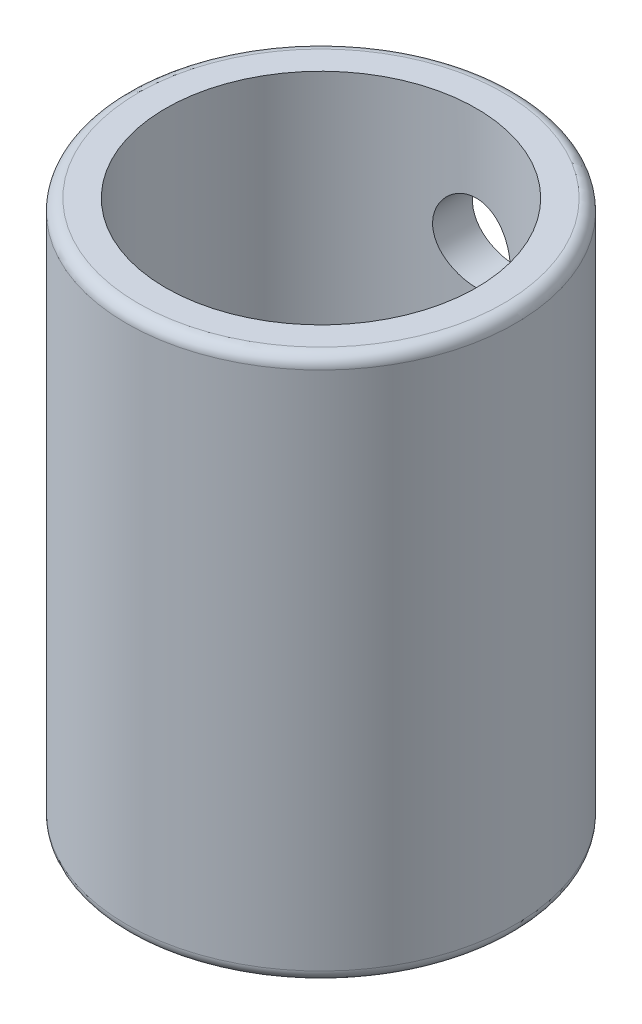
ISO-10303-21;
HEADER;
FILE_DESCRIPTION(('STEP AP214'),'2;1');
FILE_NAME('part.step','',(''),(''),'','','');
FILE_SCHEMA(('AUTOMOTIVE_DESIGN { 1 0 10303 214 1 1 1 1 }'));
ENDSEC;
DATA;
#1=APPLICATION_CONTEXT('core data for automotive mechanical design processes');
#2=APPLICATION_PROTOCOL_DEFINITION('international standard','automotive_design',2000,#1);
#3=PRODUCT_CONTEXT('',#1,'mechanical');
#4=PRODUCT('Part','Part','',(#3));
#5=PRODUCT_RELATED_PRODUCT_CATEGORY('part','',(#4));
#6=PRODUCT_DEFINITION_FORMATION('','',#4);
#7=PRODUCT_DEFINITION_CONTEXT('part definition',#1,'design');
#8=PRODUCT_DEFINITION('design','',#6,#7);
#9=PRODUCT_DEFINITION_SHAPE('','',#8);
#10=(LENGTH_UNIT() NAMED_UNIT(*) SI_UNIT(.MILLI.,.METRE.));
#11=(NAMED_UNIT(*) PLANE_ANGLE_UNIT() SI_UNIT($,.RADIAN.));
#12=(NAMED_UNIT(*) SI_UNIT($,.STERADIAN.) SOLID_ANGLE_UNIT());
#13=UNCERTAINTY_MEASURE_WITH_UNIT(LENGTH_MEASURE(1.E-05),#10,'distance_accuracy_value','');
#14=(GEOMETRIC_REPRESENTATION_CONTEXT(3) GLOBAL_UNCERTAINTY_ASSIGNED_CONTEXT((#13)) GLOBAL_UNIT_ASSIGNED_CONTEXT((#10,
#11,#12)) REPRESENTATION_CONTEXT('',''));
#15=CARTESIAN_POINT('',(0.,0.,0.));
#16=DIRECTION('',(0.,0.,1.));
#17=DIRECTION('',(1.,0.,0.));
#18=AXIS2_PLACEMENT_3D('',#15,#16,#17);
#19=CARTESIAN_POINT('',(0.,7.,0.));
#20=DIRECTION('',(0.,1.,0.));
#21=DIRECTION('',(0.,0.,1.));
#22=AXIS2_PLACEMENT_3D('',#19,#20,#21);
#23=PLANE('',#22);
#24=CARTESIAN_POINT('',(0.,7.,0.));
#25=DIRECTION('',(0.,1.,0.));
#26=DIRECTION('',(0.,0.,1.));
#27=AXIS2_PLACEMENT_3D('',#24,#25,#26);
#28=CIRCLE('',#27,2.5);
#29=CARTESIAN_POINT('',(0.,7.,2.5));
#30=VERTEX_POINT('',#29);
#31=EDGE_CURVE('E142',#30,#30,#28,.T.);
#32=ORIENTED_EDGE('',*,*,#31,.F.);
#33=EDGE_LOOP('',(#32));
#34=FACE_BOUND('',#33,.T.);
#35=CARTESIAN_POINT('',(0.,7.,0.));
#36=DIRECTION('',(0.,1.,0.));
#37=DIRECTION('',(0.,0.,1.));
#38=AXIS2_PLACEMENT_3D('',#35,#36,#37);
#39=CIRCLE('',#38,4.);
#40=CARTESIAN_POINT('',(0.,7.,4.));
#41=VERTEX_POINT('',#40);
#42=EDGE_CURVE('E148',#41,#41,#39,.F.);
#43=ORIENTED_EDGE('',*,*,#42,.F.);
#44=EDGE_LOOP('',(#43));
#45=FACE_BOUND('',#44,.T.);
#46=ADVANCED_FACE('F40',(#34,#45),#23,.T.);
#47=CARTESIAN_POINT('',(0.,0.,0.));
#48=DIRECTION('',(0.,1.,0.));
#49=DIRECTION('',(0.,0.,1.));
#50=AXIS2_PLACEMENT_3D('',#47,#48,#49);
#51=PLANE('',#50);
#52=CARTESIAN_POINT('',(0.,0.,0.));
#53=DIRECTION('',(0.,1.,0.));
#54=DIRECTION('',(0.,0.,1.));
#55=AXIS2_PLACEMENT_3D('',#52,#53,#54);
#56=CIRCLE('',#55,4.7);
#57=CARTESIAN_POINT('',(0.,0.,4.7));
#58=VERTEX_POINT('',#57);
#59=EDGE_CURVE('E54',#58,#58,#56,.F.);
#60=ORIENTED_EDGE('',*,*,#59,.T.);
#61=EDGE_LOOP('',(#60));
#62=FACE_BOUND('',#61,.T.);
#63=CARTESIAN_POINT('',(0.,0.,0.));
#64=DIRECTION('',(0.,1.,0.));
#65=DIRECTION('',(0.,0.,1.));
#66=AXIS2_PLACEMENT_3D('',#63,#64,#65);
#67=CIRCLE('',#66,2.5);
#68=CARTESIAN_POINT('',(0.,0.,2.5));
#69=VERTEX_POINT('',#68);
#70=EDGE_CURVE('E138',#69,#69,#67,.T.);
#71=ORIENTED_EDGE('',*,*,#70,.T.);
#72=EDGE_LOOP('',(#71));
#73=FACE_BOUND('',#72,.T.);
#74=ADVANCED_FACE('F100',(#62,#73),#51,.F.);
#75=CARTESIAN_POINT('',(0.,7.,0.));
#76=DIRECTION('',(0.,-1.,0.));
#77=DIRECTION('',(0.,0.,-1.));
#78=AXIS2_PLACEMENT_3D('',#75,#76,#77);
#79=CYLINDRICAL_SURFACE('',#78,5.);
#80=CARTESIAN_POINT('',(0.,12.,-5.));
#81=CARTESIAN_POINT('',(-0.0555769067926332,11.9999979555017,-4.99999897580871));
#82=CARTESIAN_POINT('',(-0.111179660201522,11.9953511570324,-4.99906385178231));
#83=CARTESIAN_POINT('',(-0.220813507689019,11.9769014998848,-4.99542365623231));
#84=CARTESIAN_POINT('',(-0.274843317541356,11.9630913671985,-4.99271717860186));
#85=CARTESIAN_POINT('',(-0.379730305263313,11.9267587263792,-4.98583649278287));
#86=CARTESIAN_POINT('',(-0.430590467933135,11.9042445631553,-4.98166369076718));
#87=CARTESIAN_POINT('',(-0.527807988864226,11.8511677524887,-4.97230398035314));
#88=CARTESIAN_POINT('',(-0.574165615075813,11.8206055843928,-4.96711713235707));
#89=CARTESIAN_POINT('',(-0.661693477314865,11.7518615057086,-4.9562216532997));
#90=CARTESIAN_POINT('',(-0.702793951158524,11.7135916446088,-4.95050745504347));
#91=CARTESIAN_POINT('',(-0.778036756608028,11.6307075836083,-4.93924180452588));
#92=CARTESIAN_POINT('',(-0.812178544770425,11.5860928886649,-4.93369036500424));
#93=CARTESIAN_POINT('',(-0.872831753347621,11.4912838069881,-4.92332441812615));
#94=CARTESIAN_POINT('',(-0.899270938865867,11.4410423562036,-4.91851707364946));
#95=CARTESIAN_POINT('',(-0.943305666580308,11.3367181809959,-4.91026268058418));
#96=CARTESIAN_POINT('',(-0.960902082437238,11.2826358366537,-4.90681549761962));
#97=CARTESIAN_POINT('',(-0.986525299884828,11.1729156360921,-4.90172805252204));
#98=CARTESIAN_POINT('',(-0.994674497958778,11.1173074558578,-4.90006470107188));
#99=CARTESIAN_POINT('',(-1.00155212772612,11.0054901786357,-4.89866375060627));
#100=CARTESIAN_POINT('',(-1.0002815227135,10.9492811436799,-4.89892595467841));
#101=CARTESIAN_POINT('',(-0.988454573101819,10.838753211979,-4.90132551148185));
#102=CARTESIAN_POINT('',(-0.978038540243906,10.7844185943727,-4.90343452858763));
#103=CARTESIAN_POINT('',(-0.948437884623051,10.678283923337,-4.90924546160001));
#104=CARTESIAN_POINT('',(-0.929252843100681,10.626483991081,-4.91294745357779));
#105=CARTESIAN_POINT('',(-0.88252478367472,10.5264847382964,-4.92155618500408));
#106=CARTESIAN_POINT('',(-0.854926151232114,10.4783121204308,-4.92647089813704));
#107=CARTESIAN_POINT('',(-0.792193574572679,10.3872291500272,-4.93694618773062));
#108=CARTESIAN_POINT('',(-0.757058764356829,10.3443194031488,-4.94250683838366));
#109=CARTESIAN_POINT('',(-0.679499934560584,10.2641705975431,-4.95377021241462));
#110=CARTESIAN_POINT('',(-0.636956161212444,10.2270474321409,-4.95947369210905));
#111=CARTESIAN_POINT('',(-0.546185024062009,10.1604461536988,-4.97028848714408));
#112=CARTESIAN_POINT('',(-0.497957587379389,10.1309681387064,-4.97539979488974));
#113=CARTESIAN_POINT('',(-0.39705938687892,10.080472490774,-4.98446690160887));
#114=CARTESIAN_POINT('',(-0.344381819585299,10.0594681063555,-4.98842088848272));
#115=CARTESIAN_POINT('',(-0.236148976448664,10.0266395259614,-4.99471408987858));
#116=CARTESIAN_POINT('',(-0.180594050072449,10.0148142179264,-4.99705350000531));
#117=CARTESIAN_POINT('',(-0.0691794056271505,10.0008435462057,-4.99982671866868));
#118=CARTESIAN_POINT('',(-0.0133403283255761,9.99853958045973,-5.0002917465247));
#119=CARTESIAN_POINT('',(0.0979249341927143,10.0032498589422,-4.99935051930103));
#120=CARTESIAN_POINT('',(0.153351142443793,10.0102635793526,-4.99794436941446));
#121=CARTESIAN_POINT('',(0.261705659946541,10.033278373544,-4.99343832008018));
#122=CARTESIAN_POINT('',(0.314651948339904,10.0491980684979,-4.99035376404206));
#123=CARTESIAN_POINT('',(0.417123627499668,10.0894839826558,-4.98283552061033));
#124=CARTESIAN_POINT('',(0.46664876163754,10.1138508346768,-4.97840173214227));
#125=CARTESIAN_POINT('',(0.561541173686218,10.1706824906513,-4.96859911533294));
#126=CARTESIAN_POINT('',(0.606850126752189,10.2032427810389,-4.96321950437052));
#127=CARTESIAN_POINT('',(0.691418019119207,10.2754091912073,-4.95214734829882));
#128=CARTESIAN_POINT('',(0.730676308930763,10.3150160663999,-4.94645476968388));
#129=CARTESIAN_POINT('',(0.802640590774177,10.4008733518911,-4.93529303556965));
#130=CARTESIAN_POINT('',(0.835237702448656,10.4472157442213,-4.92982860233304));
#131=CARTESIAN_POINT('',(0.892185420051206,10.5448113613567,-4.91984191796194));
#132=CARTESIAN_POINT('',(0.916536355922903,10.5960643895736,-4.91531962913342));
#133=CARTESIAN_POINT('',(0.95615184158196,10.7017682461495,-4.90776740584383));
#134=CARTESIAN_POINT('',(0.971463499791051,10.7562008412103,-4.90472974872187));
#135=CARTESIAN_POINT('',(0.992708651627197,10.8669334534909,-4.90047436792025));
#136=CARTESIAN_POINT('',(0.998643368225113,10.9232332262093,-4.89925640691111));
#137=CARTESIAN_POINT('',(1.00092091086747,11.0350088645443,-4.89879149631379));
#138=CARTESIAN_POINT('',(0.997435788070896,11.090481148927,-4.89950919189301));
#139=CARTESIAN_POINT('',(0.981352304100061,11.200031649905,-4.90275573484614));
#140=CARTESIAN_POINT('',(0.968754016129298,11.2541098776948,-4.90528456767169));
#141=CARTESIAN_POINT('',(0.934878568498954,11.3592277112405,-4.91185264219159));
#142=CARTESIAN_POINT('',(0.913622506717344,11.4102743605024,-4.91588821018831));
#143=CARTESIAN_POINT('',(0.863054644601604,11.5081037207344,-4.9250171497417));
#144=CARTESIAN_POINT('',(0.833742168774882,11.5548860737251,-4.93011060998894));
#145=CARTESIAN_POINT('',(0.767305914786414,11.6437155721503,-4.94088960523225));
#146=CARTESIAN_POINT('',(0.730057887235181,11.6856687652676,-4.94658372909699));
#147=CARTESIAN_POINT('',(0.649064369013142,11.7627862055292,-4.95786081871955));
#148=CARTESIAN_POINT('',(0.605317387153335,11.7979488903173,-4.96344375863184));
#149=CARTESIAN_POINT('',(0.512017629088247,11.8608346439464,-4.97393832387971));
#150=CARTESIAN_POINT('',(0.462408884429835,11.88847600328,-4.97884231219246));
#151=CARTESIAN_POINT('',(0.359166360940732,11.9349861225966,-4.98735125085));
#152=CARTESIAN_POINT('',(0.305536260863126,11.9538627895325,-4.99095737138616));
#153=CARTESIAN_POINT('',(0.209821488923779,11.9786519480447,-4.99576372595371));
#154=CARTESIAN_POINT('',(0.168281664013784,11.9866431937078,-4.99734303158452));
#155=CARTESIAN_POINT('',(0.0844995252100669,11.9973179123584,-4.99946154139893));
#156=CARTESIAN_POINT('',(0.042257233748619,12.0000015545098,-5.00000077873155));
#157=CARTESIAN_POINT('',(0.,12.,-5.));
#158=B_SPLINE_CURVE_WITH_KNOTS('',3,(#80,#81,#82,#83,#84,#85,#86,#87,#88,#89,#90,#91,#92,#93,
#94,#95,#96,#97,#98,#99,#100,#101,#102,#103,#104,#105,#106,#107,#108,#109,#110,#111,#112,#113,
#114,#115,#116,#117,#118,#119,#120,#121,#122,#123,#124,#125,#126,#127,#128,#129,#130,#131,#132,
#133,#134,#135,#136,#137,#138,#139,#140,#141,#142,#143,#144,#145,#146,#147,#148,#149,#150,#151,
#152,#153,#154,#155,#156,#157),.UNSPECIFIED.,.T.,.F.,(4,2,2,2,2,2,2,2,2,2,2,2,2,2,2,2,2,2,2,2,2,
2,2,2,2,2,2,2,2,2,2,2,2,2,2,2,2,2,4),(0.,0.166576130661258,0.333284650691323,0.499833735250343,
0.666372902230864,0.834932670112186,1.00350559674737,1.17361195005923,1.34370149365198,
1.51156185103588,1.67940504281225,1.84471727006278,2.0100373925373,2.17647490203593,
2.34293154749671,2.51238252491351,2.6818356753982,2.85155274854024,3.02124925698036,
3.18810735676265,3.35495607657868,3.52030453950724,3.68566539216023,3.85305066033359,
4.0204538834593,4.19040628579226,4.36035188723467,4.52940381032723,4.69843368330415,
4.86439722567702,5.03035943492609,5.1959196125311,5.36149367581867,5.52988076239143,
5.69830654532931,5.86849496675637,6.03852955517519,6.16518775289894,6.29184191370996),.UNSPECIFIED.);
#159=CARTESIAN_POINT('',(0.,12.,-5.));
#160=VERTEX_POINT('',#159);
#161=EDGE_CURVE('E71',#160,#160,#158,.T.);
#162=ORIENTED_EDGE('',*,*,#161,.T.);
#163=EDGE_LOOP('',(#162));
#164=FACE_BOUND('',#163,.T.);
#165=CARTESIAN_POINT('',(0.,4.,-5.));
#166=CARTESIAN_POINT('',(-0.0555769067926332,3.99999795550166,-4.99999897580871));
#167=CARTESIAN_POINT('',(-0.111179660201522,3.99535115703235,-4.99906385178231));
#168=CARTESIAN_POINT('',(-0.220813507689019,3.97690149988475,-4.99542365623231));
#169=CARTESIAN_POINT('',(-0.274843317541356,3.96309136719849,-4.99271717860186));
#170=CARTESIAN_POINT('',(-0.379730305263313,3.92675872637921,-4.98583649278287));
#171=CARTESIAN_POINT('',(-0.430590467933134,3.90424456315531,-4.98166369076718));
#172=CARTESIAN_POINT('',(-0.527807988864225,3.85116775248871,-4.97230398035314));
#173=CARTESIAN_POINT('',(-0.574165615075812,3.8206055843928,-4.96711713235707));
#174=CARTESIAN_POINT('',(-0.661693477314865,3.75186150570857,-4.9562216532997));
#175=CARTESIAN_POINT('',(-0.702793951158524,3.7135916446088,-4.95050745504347));
#176=CARTESIAN_POINT('',(-0.778036756608028,3.6307075836083,-4.93924180452588));
#177=CARTESIAN_POINT('',(-0.812178544770424,3.58609288866488,-4.93369036500424));
#178=CARTESIAN_POINT('',(-0.87283175334762,3.49128380698813,-4.92332441812615));
#179=CARTESIAN_POINT('',(-0.899270938865866,3.44104235620364,-4.91851707364946));
#180=CARTESIAN_POINT('',(-0.943305666580308,3.33671818099592,-4.91026268058418));
#181=CARTESIAN_POINT('',(-0.960902082437238,3.28263583665366,-4.90681549761962));
#182=CARTESIAN_POINT('',(-0.986525299884827,3.17291563609208,-4.90172805252204));
#183=CARTESIAN_POINT('',(-0.994674497958777,3.11730745585777,-4.90006470107188));
#184=CARTESIAN_POINT('',(-1.00155212772612,3.00549017863566,-4.89866375060627));
#185=CARTESIAN_POINT('',(-1.0002815227135,2.94928114367986,-4.89892595467841));
#186=CARTESIAN_POINT('',(-0.988454573101819,2.838753211979,-4.90132551148185));
#187=CARTESIAN_POINT('',(-0.978038540243905,2.78441859437269,-4.90343452858763));
#188=CARTESIAN_POINT('',(-0.94843788462305,2.678283923337,-4.90924546160001));
#189=CARTESIAN_POINT('',(-0.929252843100681,2.62648399108099,-4.91294745357779));
#190=CARTESIAN_POINT('',(-0.88252478367472,2.5264847382964,-4.92155618500408));
#191=CARTESIAN_POINT('',(-0.854926151232115,2.47831212043083,-4.92647089813704));
#192=CARTESIAN_POINT('',(-0.792193574572679,2.38722915002719,-4.93694618773062));
#193=CARTESIAN_POINT('',(-0.757058764356829,2.34431940314884,-4.94250683838366));
#194=CARTESIAN_POINT('',(-0.679499934560584,2.26417059754306,-4.95377021241462));
#195=CARTESIAN_POINT('',(-0.636956161212445,2.22704743214087,-4.95947369210905));
#196=CARTESIAN_POINT('',(-0.54618502406201,2.16044615369878,-4.97028848714408));
#197=CARTESIAN_POINT('',(-0.497957587379389,2.13096813870642,-4.97539979488974));
#198=CARTESIAN_POINT('',(-0.397059386878921,2.08047249077403,-4.98446690160887));
#199=CARTESIAN_POINT('',(-0.3443818195853,2.05946810635546,-4.98842088848272));
#200=CARTESIAN_POINT('',(-0.236148976448665,2.02663952596143,-4.99471408987858));
#201=CARTESIAN_POINT('',(-0.180594050072449,2.01481421792637,-4.99705350000531));
#202=CARTESIAN_POINT('',(-0.0691794056271502,2.00084354620572,-4.99982671866868));
#203=CARTESIAN_POINT('',(-0.0133403283255759,1.99853958045973,-5.0002917465247));
#204=CARTESIAN_POINT('',(0.0979249341927142,2.00324985894218,-4.99935051930103));
#205=CARTESIAN_POINT('',(0.153351142443793,2.0102635793526,-4.99794436941446));
#206=CARTESIAN_POINT('',(0.261705659946541,2.03327837354396,-4.99343832008018));
#207=CARTESIAN_POINT('',(0.314651948339903,2.0491980684979,-4.99035376404206));
#208=CARTESIAN_POINT('',(0.417123627499667,2.08948398265581,-4.98283552061033));
#209=CARTESIAN_POINT('',(0.466648761637539,2.11385083467683,-4.97840173214227));
#210=CARTESIAN_POINT('',(0.561541173686218,2.17068249065131,-4.96859911533294));
#211=CARTESIAN_POINT('',(0.606850126752188,2.20324278103895,-4.96321950437052));
#212=CARTESIAN_POINT('',(0.691418019119207,2.27540919120728,-4.95214734829882));
#213=CARTESIAN_POINT('',(0.730676308930763,2.31501606639987,-4.94645476968388));
#214=CARTESIAN_POINT('',(0.802640590774176,2.40087335189112,-4.93529303556965));
#215=CARTESIAN_POINT('',(0.835237702448655,2.44721574422134,-4.92982860233304));
#216=CARTESIAN_POINT('',(0.892185420051206,2.54481136135668,-4.91984191796194));
#217=CARTESIAN_POINT('',(0.916536355922903,2.59606438957355,-4.91531962913342));
#218=CARTESIAN_POINT('',(0.95615184158196,2.70176824614955,-4.90776740584383));
#219=CARTESIAN_POINT('',(0.971463499791051,2.75620084121032,-4.90472974872187));
#220=CARTESIAN_POINT('',(0.992708651627196,2.86693345349091,-4.90047436792025));
#221=CARTESIAN_POINT('',(0.998643368225112,2.92323322620935,-4.89925640691111));
#222=CARTESIAN_POINT('',(1.00092091086747,3.03500886454432,-4.89879149631379));
#223=CARTESIAN_POINT('',(0.997435788070896,3.09048114892701,-4.89950919189301));
#224=CARTESIAN_POINT('',(0.981352304100061,3.20003164990503,-4.90275573484614));
#225=CARTESIAN_POINT('',(0.968754016129298,3.2541098776948,-4.90528456767169));
#226=CARTESIAN_POINT('',(0.934878568498954,3.35922771124054,-4.91185264219159));
#227=CARTESIAN_POINT('',(0.913622506717344,3.41027436050242,-4.91588821018831));
#228=CARTESIAN_POINT('',(0.863054644601604,3.50810372073444,-4.9250171497417));
#229=CARTESIAN_POINT('',(0.833742168774882,3.55488607372514,-4.93011060998894));
#230=CARTESIAN_POINT('',(0.767305914786414,3.64371557215031,-4.94088960523225));
#231=CARTESIAN_POINT('',(0.73005788723518,3.6856687652676,-4.94658372909699));
#232=CARTESIAN_POINT('',(0.64906436901314,3.76278620552917,-4.95786081871955));
#233=CARTESIAN_POINT('',(0.605317387153335,3.79794889031727,-4.96344375863184));
#234=CARTESIAN_POINT('',(0.512017629088246,3.86083464394645,-4.97393832387971));
#235=CARTESIAN_POINT('',(0.462408884429834,3.88847600328002,-4.97884231219246));
#236=CARTESIAN_POINT('',(0.359166360940732,3.93498612259659,-4.98735125085));
#237=CARTESIAN_POINT('',(0.305536260863126,3.95386278953249,-4.99095737138616));
#238=CARTESIAN_POINT('',(0.209821488923779,3.97865194804472,-4.99576372595371));
#239=CARTESIAN_POINT('',(0.168281664013784,3.98664319370776,-4.99734303158452));
#240=CARTESIAN_POINT('',(0.0844995252100669,3.99731791235836,-4.99946154139893));
#241=CARTESIAN_POINT('',(0.042257233748619,4.00000155450977,-5.00000077873155));
#242=CARTESIAN_POINT('',(0.,4.,-5.));
#243=B_SPLINE_CURVE_WITH_KNOTS('',3,(#165,#166,#167,#168,#169,#170,#171,#172,#173,#174,#175,
#176,#177,#178,#179,#180,#181,#182,#183,#184,#185,#186,#187,#188,#189,#190,#191,#192,#193,#194,
#195,#196,#197,#198,#199,#200,#201,#202,#203,#204,#205,#206,#207,#208,#209,#210,#211,#212,#213,
#214,#215,#216,#217,#218,#219,#220,#221,#222,#223,#224,#225,#226,#227,#228,#229,#230,#231,#232,
#233,#234,#235,#236,#237,#238,#239,#240,#241,#242),.UNSPECIFIED.,.T.,.F.,(4,2,2,2,2,2,2,2,2,2,2,
2,2,2,2,2,2,2,2,2,2,2,2,2,2,2,2,2,2,2,2,2,2,2,2,2,2,2,4),(0.,0.166576130661258,
0.333284650691323,0.499833735250341,0.666372902230863,0.834932670112185,1.00350559674737,
1.17361195005923,1.34370149365197,1.51156185103587,1.67940504281225,1.84471727006278,
2.0100373925373,2.17647490203593,2.3429315474967,2.51238252491351,2.6818356753982,
2.85155274854024,3.02124925698036,3.18810735676265,3.35495607657868,3.52030453950723,
3.68566539216022,3.85305066033359,4.0204538834593,4.19040628579226,4.36035188723467,
4.52940381032723,4.69843368330415,4.86439722567701,5.03035943492608,5.1959196125311,
5.36149367581867,5.52988076239143,5.6983065453293,5.86849496675637,6.03852955517519,
6.16518775289894,6.29184191370996),.UNSPECIFIED.);
#244=CARTESIAN_POINT('',(0.,4.,-5.));
#245=VERTEX_POINT('',#244);
#246=EDGE_CURVE('E90',#245,#245,#243,.T.);
#247=ORIENTED_EDGE('',*,*,#246,.T.);
#248=EDGE_LOOP('',(#247));
#249=FACE_BOUND('',#248,.T.);
#250=CARTESIAN_POINT('',(0.,0.3,0.));
#251=DIRECTION('',(0.,1.,0.));
#252=DIRECTION('',(0.,0.,1.));
#253=AXIS2_PLACEMENT_3D('',#250,#251,#252);
#254=CIRCLE('',#253,5.);
#255=CARTESIAN_POINT('',(0.,0.3,5.));
#256=VERTEX_POINT('',#255);
#257=EDGE_CURVE('E60',#256,#256,#254,.T.);
#258=ORIENTED_EDGE('',*,*,#257,.T.);
#259=EDGE_LOOP('',(#258));
#260=FACE_BOUND('',#259,.T.);
#261=CARTESIAN_POINT('',(0.,13.7,0.));
#262=DIRECTION('',(0.,1.,0.));
#263=DIRECTION('',(0.,0.,1.));
#264=AXIS2_PLACEMENT_3D('',#261,#262,#263);
#265=CIRCLE('',#264,5.);
#266=CARTESIAN_POINT('',(0.,13.7,5.));
#267=VERTEX_POINT('',#266);
#268=EDGE_CURVE('E153',#267,#267,#265,.F.);
#269=ORIENTED_EDGE('',*,*,#268,.T.);
#270=EDGE_LOOP('',(#269));
#271=FACE_BOUND('',#270,.T.);
#272=ADVANCED_FACE('F95',(#164,#249,#260,#271),#79,.T.);
#273=CARTESIAN_POINT('',(0.,7.,0.));
#274=DIRECTION('',(0.,-1.,0.));
#275=DIRECTION('',(0.,0.,-1.));
#276=AXIS2_PLACEMENT_3D('',#273,#274,#275);
#277=CYLINDRICAL_SURFACE('',#276,2.5);
#278=CARTESIAN_POINT('',(0.,4.,-2.5));
#279=CARTESIAN_POINT('',(-0.0537465027214457,3.99999507408814,-2.49999635613542));
#280=CARTESIAN_POINT('',(-0.107586282045337,3.99564112395581,-2.49824647153466));
#281=CARTESIAN_POINT('',(-0.213748240208948,3.97837614823938,-2.49141726550321));
#282=CARTESIAN_POINT('',(-0.266065888780624,3.96544186045693,-2.48632889349439));
#283=CARTESIAN_POINT('',(-0.367476961363701,3.93156196097058,-2.47337104606559));
#284=CARTESIAN_POINT('',(-0.416580330808479,3.91064257689164,-2.46551068182036));
#285=CARTESIAN_POINT('',(-0.510535985164184,3.86149041333673,-2.44778305398039));
#286=CARTESIAN_POINT('',(-0.555389738375496,3.83326017254053,-2.43791648729028));
#287=CARTESIAN_POINT('',(-0.641750503785196,3.76888225071953,-2.41665443085209));
#288=CARTESIAN_POINT('',(-0.683031136275106,3.73244667187987,-2.40521148464595));
#289=CARTESIAN_POINT('',(-0.759087502392361,3.65329999826161,-2.38230288453097));
#290=CARTESIAN_POINT('',(-0.793860053566766,3.61058585139413,-2.37083722226896));
#291=CARTESIAN_POINT('',(-0.857437283646439,3.51778596487887,-2.34861395898568));
#292=CARTESIAN_POINT('',(-0.885907490597737,3.4674567569884,-2.33791057982476));
#293=CARTESIAN_POINT('',(-0.933877359518574,3.36223180078998,-2.31916823593396));
#294=CARTESIAN_POINT('',(-0.953381282142917,3.30733823607582,-2.31112800622088));
#295=CARTESIAN_POINT('',(-0.981949411697933,3.19714383320395,-2.29913178830409));
#296=CARTESIAN_POINT('',(-0.991446982902824,3.14197438221189,-2.29500710177802));
#297=CARTESIAN_POINT('',(-1.00108648082001,3.03068250084637,-2.29082002024572));
#298=CARTESIAN_POINT('',(-1.00123300815661,2.97456055268749,-2.29075562761384));
#299=CARTESIAN_POINT('',(-0.992494683752272,2.86712166427098,-2.29455250139997));
#300=CARTESIAN_POINT('',(-0.984237657152568,2.81574214279548,-2.29814087519225));
#301=CARTESIAN_POINT('',(-0.95997344014891,2.71517022199664,-2.30838093803918));
#302=CARTESIAN_POINT('',(-0.943964897402315,2.66597820594485,-2.31503316160836));
#303=CARTESIAN_POINT('',(-0.904347366275536,2.56999108190198,-2.33079742544265));
#304=CARTESIAN_POINT('',(-0.880589931157658,2.52326538047266,-2.33995689640394));
#305=CARTESIAN_POINT('',(-0.826253230366107,2.43429209181922,-2.35969058194945));
#306=CARTESIAN_POINT('',(-0.795671402550422,2.3920461952986,-2.37026532728424));
#307=CARTESIAN_POINT('',(-0.725775299727217,2.309795135599,-2.39263368371135));
#308=CARTESIAN_POINT('',(-0.685968731485317,2.27021563527699,-2.40445832488076));
#309=CARTESIAN_POINT('',(-0.600157213715096,2.19815776099898,-2.42729912479141));
#310=CARTESIAN_POINT('',(-0.554151032667217,2.16568080129485,-2.43831512222662));
#311=CARTESIAN_POINT('',(-0.456038826302922,2.10819127629208,-2.45857340632274));
#312=CARTESIAN_POINT('',(-0.403830245673239,2.08333885940147,-2.46777635047707));
#313=CARTESIAN_POINT('',(-0.295511882741441,2.04291606946097,-2.48307414164379));
#314=CARTESIAN_POINT('',(-0.239404098424837,2.0273409812213,-2.48917056731191));
#315=CARTESIAN_POINT('',(-0.12844794380391,2.00677585229015,-2.49728069753455));
#316=CARTESIAN_POINT('',(-0.0737216469927674,2.00121377287322,-2.49951472916757));
#317=CARTESIAN_POINT('',(0.0359226549039085,1.99914344973569,-2.50034239255315));
#318=CARTESIAN_POINT('',(0.0908406066119617,2.00263285922624,-2.49893696791146));
#319=CARTESIAN_POINT('',(0.196716369560994,2.018145876276,-2.49278783531876));
#320=CARTESIAN_POINT('',(0.247741245887737,2.02977899017549,-2.48819695672762));
#321=CARTESIAN_POINT('',(0.34706771403039,2.06071785415491,-2.4762972070275));
#322=CARTESIAN_POINT('',(0.395368955112422,2.08002458983434,-2.46898798678265));
#323=CARTESIAN_POINT('',(0.489539392908351,2.12639246983997,-2.45208297385406));
#324=CARTESIAN_POINT('',(0.535289011377703,2.15367273602157,-2.44242407989902));
#325=CARTESIAN_POINT('',(0.621721795623277,2.21497016195282,-2.42186682372762));
#326=CARTESIAN_POINT('',(0.662402920380562,2.24899002146131,-2.41096796555135));
#327=CARTESIAN_POINT('',(0.740361521514409,2.32543500647481,-2.38822558819056));
#328=CARTESIAN_POINT('',(0.777236966903032,2.3682667707531,-2.37636720712526));
#329=CARTESIAN_POINT('',(0.843375598706855,2.45972004150468,-2.35370836458566));
#330=CARTESIAN_POINT('',(0.872637530668754,2.50834250016997,-2.34290807763255));
#331=CARTESIAN_POINT('',(0.922903750965813,2.61073084729705,-2.32357149953854));
#332=CARTESIAN_POINT('',(0.943825297267226,2.66454199960616,-2.31505815442394));
#333=CARTESIAN_POINT('',(0.976148109852652,2.77536682585758,-2.30161836738966));
#334=CARTESIAN_POINT('',(0.987556402634657,2.83237810290621,-2.29668927847999));
#335=CARTESIAN_POINT('',(0.999857808639201,2.94356395088727,-2.29135879649963));
#336=CARTESIAN_POINT('',(1.00144854115143,2.99764741979668,-2.29065710504086));
#337=CARTESIAN_POINT('',(0.995901579638762,3.10527242885665,-2.29307418016549));
#338=CARTESIAN_POINT('',(0.988764993956891,3.15881403695129,-2.29619246162397));
#339=CARTESIAN_POINT('',(0.966535683076824,3.26166609492752,-2.3056332453951));
#340=CARTESIAN_POINT('',(0.951768746785489,3.3110601372165,-2.31182415913725));
#341=CARTESIAN_POINT('',(0.915002724245506,3.40668931480674,-2.32662000616348));
#342=CARTESIAN_POINT('',(0.893001640696907,3.45292357344991,-2.33522560603003));
#343=CARTESIAN_POINT('',(0.840936381379865,3.54380480963539,-2.35449304802246));
#344=CARTESIAN_POINT('',(0.810482667579745,3.58820933506524,-2.36524441156621));
#345=CARTESIAN_POINT('',(0.742946059635748,3.67149665860188,-2.38731902186119));
#346=CARTESIAN_POINT('',(0.705861167409061,3.71037778606416,-2.39864244024203));
#347=CARTESIAN_POINT('',(0.623252753136232,3.78410142663181,-2.42146783543697));
#348=CARTESIAN_POINT('',(0.577338000573069,3.81851865344903,-2.43293378981093));
#349=CARTESIAN_POINT('',(0.47995016014289,3.87916852131082,-2.45400203356858));
#350=CARTESIAN_POINT('',(0.428474502273619,3.90539735607626,-2.46360345546453));
#351=CARTESIAN_POINT('',(0.322369031247602,3.94831110759515,-2.47969857407931));
#352=CARTESIAN_POINT('',(0.267815809109848,3.96516466178017,-2.48624681527514));
#353=CARTESIAN_POINT('',(0.156438273140611,3.98931956047713,-2.49572153104683));
#354=CARTESIAN_POINT('',(0.0996217629294565,3.99665121837195,-2.49865949747819));
#355=CARTESIAN_POINT('',(0.0284561489454648,3.99969769048914,-2.49987949752068));
#356=CARTESIAN_POINT('',(0.0142313443703792,4.0000013043146,-2.50000096484588));
#357=CARTESIAN_POINT('',(0.,4.,-2.5));
#358=B_SPLINE_CURVE_WITH_KNOTS('',3,(#278,#279,#280,#281,#282,#283,#284,#285,#286,#287,#288,
#289,#290,#291,#292,#293,#294,#295,#296,#297,#298,#299,#300,#301,#302,#303,#304,#305,#306,#307,
#308,#309,#310,#311,#312,#313,#314,#315,#316,#317,#318,#319,#320,#321,#322,#323,#324,#325,#326,
#327,#328,#329,#330,#331,#332,#333,#334,#335,#336,#337,#338,#339,#340,#341,#342,#343,#344,#345,
#346,#347,#348,#349,#350,#351,#352,#353,#354,#355,#356,#357),.UNSPECIFIED.,.T.,.F.,(4,2,2,2,2,2,
2,2,2,2,2,2,2,2,2,2,2,2,2,2,2,2,2,2,2,2,2,2,2,2,2,2,2,2,2,2,2,2,2,4),(0.,0.161201493946536,
0.322841818003967,0.48395572873579,0.645013767839921,0.812986908501986,0.981041974672057,
1.15657629409608,1.33202711559134,1.49952052654414,1.66693153170244,1.82269164200686,
1.97847893628024,2.13744563149408,2.29647210969092,2.46779174593278,2.63914546419866,
2.81388456581403,2.98853478056895,3.15284592264004,3.31711446785041,3.47400227782183,
3.63091024496898,3.79261756699131,3.95438979749484,4.12684237312207,4.29932334521874,
4.47347522570414,4.64749836322967,4.80899836696374,4.97047786281523,5.12557159274384,
5.28070817902581,5.44472734028346,5.60879600674197,5.78350211766918,5.95828931820266,
6.12982150506659,6.30080626202171,6.34349022948398),.UNSPECIFIED.);
#359=CARTESIAN_POINT('',(0.,4.,-2.5));
#360=VERTEX_POINT('',#359);
#361=EDGE_CURVE('E44',#360,#360,#358,.T.);
#362=ORIENTED_EDGE('',*,*,#361,.F.);
#363=EDGE_LOOP('',(#362));
#364=FACE_BOUND('',#363,.T.);
#365=ORIENTED_EDGE('',*,*,#31,.T.);
#366=EDGE_LOOP('',(#365));
#367=FACE_BOUND('',#366,.T.);
#368=ORIENTED_EDGE('',*,*,#70,.F.);
#369=EDGE_LOOP('',(#368));
#370=FACE_BOUND('',#369,.T.);
#371=ADVANCED_FACE('F99',(#364,#367,#370),#277,.F.);
#372=CARTESIAN_POINT('',(0.,14.,0.));
#373=DIRECTION('',(0.,1.,0.));
#374=DIRECTION('',(0.,0.,1.));
#375=AXIS2_PLACEMENT_3D('',#372,#373,#374);
#376=PLANE('',#375);
#377=CARTESIAN_POINT('',(0.,14.,0.));
#378=DIRECTION('',(0.,1.,0.));
#379=DIRECTION('',(0.,0.,1.));
#380=AXIS2_PLACEMENT_3D('',#377,#378,#379);
#381=CIRCLE('',#380,4.7);
#382=CARTESIAN_POINT('',(0.,14.,4.7));
#383=VERTEX_POINT('',#382);
#384=EDGE_CURVE('E10',#383,#383,#381,.T.);
#385=ORIENTED_EDGE('',*,*,#384,.T.);
#386=EDGE_LOOP('',(#385));
#387=FACE_BOUND('',#386,.T.);
#388=CARTESIAN_POINT('',(0.,14.,0.));
#389=DIRECTION('',(0.,1.,0.));
#390=DIRECTION('',(0.,0.,1.));
#391=AXIS2_PLACEMENT_3D('',#388,#389,#390);
#392=CIRCLE('',#391,4.);
#393=CARTESIAN_POINT('',(0.,14.,4.));
#394=VERTEX_POINT('',#393);
#395=EDGE_CURVE('E135',#394,#394,#392,.T.);
#396=ORIENTED_EDGE('',*,*,#395,.F.);
#397=EDGE_LOOP('',(#396));
#398=FACE_BOUND('',#397,.T.);
#399=ADVANCED_FACE('F113',(#387,#398),#376,.T.);
#400=CARTESIAN_POINT('',(0.,14.,0.));
#401=DIRECTION('',(0.,-1.,0.));
#402=DIRECTION('',(0.,0.,-1.));
#403=AXIS2_PLACEMENT_3D('',#400,#401,#402);
#404=CYLINDRICAL_SURFACE('',#403,4.);
#405=CARTESIAN_POINT('',(0.,12.,-4.));
#406=CARTESIAN_POINT('',(-0.0552507257798207,11.9999984495079,-3.99999906578675));
#407=CARTESIAN_POINT('',(-0.110518771887175,11.9954056328175,-3.99884385421219));
#408=CARTESIAN_POINT('',(-0.219470882513688,11.977183232462,-3.99434742553261));
#409=CARTESIAN_POINT('',(-0.27315403124716,11.9635485269748,-3.99100496946646));
#410=CARTESIAN_POINT('',(-0.377347248121718,11.9277071643586,-3.98250417554693));
#411=CARTESIAN_POINT('',(-0.427861042286669,11.9055108008565,-3.97734801894725));
#412=CARTESIAN_POINT('',(-0.524448087936285,11.8532124066368,-3.96576895871729));
#413=CARTESIAN_POINT('',(-0.57052118956584,11.823110109254,-3.95934601236034));
#414=CARTESIAN_POINT('',(-0.657867951533947,11.7551994735639,-3.94578275727868));
#415=CARTESIAN_POINT('',(-0.699037126707382,11.7172589500272,-3.93863138099022));
#416=CARTESIAN_POINT('',(-0.774499284802203,11.6350318633941,-3.92449080078353));
#417=CARTESIAN_POINT('',(-0.808791491299423,11.5907445847023,-3.91750161525566));
#418=CARTESIAN_POINT('',(-0.870017695199355,11.4962698488417,-3.9043651713314));
#419=CARTESIAN_POINT('',(-0.896834810616905,11.4460045127931,-3.89823196313737));
#420=CARTESIAN_POINT('',(-0.941597939033686,11.3415010588944,-3.88766329874815));
#421=CARTESIAN_POINT('',(-0.959545370292889,11.2872635777828,-3.88322757115193));
#422=CARTESIAN_POINT('',(-0.985703224536194,11.1775043345317,-3.87666984478367));
#423=CARTESIAN_POINT('',(-0.994101512222226,11.1220300693001,-3.87450327383617));
#424=CARTESIAN_POINT('',(-1.00150785004524,11.0104209539907,-3.8725957502516));
#425=CARTESIAN_POINT('',(-1.00051742787865,10.9542862128676,-3.87285440299096));
#426=CARTESIAN_POINT('',(-0.98932434975952,10.8443894615037,-3.87572803664412));
#427=CARTESIAN_POINT('',(-0.979345560127014,10.7906029190233,-3.87828575334586));
#428=CARTESIAN_POINT('',(-0.950816124602072,10.6854926327258,-3.88537806450989));
#429=CARTESIAN_POINT('',(-0.932264868046283,10.6341690646473,-3.88991279980464));
#430=CARTESIAN_POINT('',(-0.886926318624769,10.5348413224986,-3.90050075936124));
#431=CARTESIAN_POINT('',(-0.860057778155274,10.4868758854736,-3.90656884979614));
#432=CARTESIAN_POINT('',(-0.798904184009969,10.3960541934954,-3.91953140564257));
#433=CARTESIAN_POINT('',(-0.764617832539225,10.3531988346218,-3.9264260155649));
#434=CARTESIAN_POINT('',(-0.688442283120811,10.2725309228704,-3.94050587026521));
#435=CARTESIAN_POINT('',(-0.646364172110573,10.2348970066258,-3.94769379651981));
#436=CARTESIAN_POINT('',(-0.556407945002466,10.1671858383574,-3.96137310385857));
#437=CARTESIAN_POINT('',(-0.508529651805295,10.1371088171576,-3.96786446366277));
#438=CARTESIAN_POINT('',(-0.408077259120927,10.0852996091837,-3.97945154729455));
#439=CARTESIAN_POINT('',(-0.355487595472415,10.0635964398304,-3.9845424008515));
#440=CARTESIAN_POINT('',(-0.247250672095254,10.0293884628603,-3.99271944660946));
#441=CARTESIAN_POINT('',(-0.191603999433655,10.0168818957212,-3.99580602226187));
#442=CARTESIAN_POINT('',(-0.0803599802600161,10.0016949562941,-3.9995699951425));
#443=CARTESIAN_POINT('',(-0.0247978133254714,9.9987713159498,-4.00030702338852));
#444=CARTESIAN_POINT('',(0.0860219165343403,10.0021660013703,-3.999458698763));
#445=CARTESIAN_POINT('',(0.141279506429731,10.0084834951994,-3.99787355494564));
#446=CARTESIAN_POINT('',(0.249076179184329,10.0299806055943,-3.99259720751571));
#447=CARTESIAN_POINT('',(0.301643412645837,10.0450275089847,-3.98893756123874));
#448=CARTESIAN_POINT('',(0.403504861635009,10.0834047226856,-3.97992471089423));
#449=CARTESIAN_POINT('',(0.452798746021757,10.1067358695421,-3.97457133579928));
#450=CARTESIAN_POINT('',(0.5476820896199,10.1614907525832,-3.96262205284207));
#451=CARTESIAN_POINT('',(0.593190294557222,10.1930507415978,-3.95600578244621));
#452=CARTESIAN_POINT('',(0.678351075762166,10.2631932725313,-3.94229672791613));
#453=CARTESIAN_POINT('',(0.71800263931534,10.3017770264113,-3.93520386167803));
#454=CARTESIAN_POINT('',(0.791327045381821,10.3860013072296,-3.92112637973847));
#455=CARTESIAN_POINT('',(0.824829245081356,10.4317918020016,-3.91414869458187));
#456=CARTESIAN_POINT('',(0.8836738393418,10.5284884229771,-3.90128585584826));
#457=CARTESIAN_POINT('',(0.909016596105292,10.5793943219732,-3.89540065378017));
#458=CARTESIAN_POINT('',(0.950634280406195,10.6846038149421,-3.88545396489777));
#459=CARTESIAN_POINT('',(0.966962931102711,10.7388850855627,-3.88138170194604));
#460=CARTESIAN_POINT('',(0.990230439969186,10.8495397585927,-3.87551162726789));
#461=CARTESIAN_POINT('',(0.997171351652439,10.9059127006883,-3.87371331813291));
#462=CARTESIAN_POINT('',(1.00135906022266,11.0174140159035,-3.87263267469304));
#463=CARTESIAN_POINT('',(0.998878598520079,11.0725316234165,-3.87327955152176));
#464=CARTESIAN_POINT('',(0.984918185541911,11.1815359257787,-3.87685272671895));
#465=CARTESIAN_POINT('',(0.973438415124513,11.2354226453424,-3.87977897927904));
#466=CARTESIAN_POINT('',(0.941954212961863,11.3401389727103,-3.88754173788482));
#467=CARTESIAN_POINT('',(0.922000936453583,11.3909848701601,-3.89236676824206));
#468=CARTESIAN_POINT('',(0.874176609070047,11.4886435884758,-3.90338503816552));
#469=CARTESIAN_POINT('',(0.846304460022792,11.5354558487913,-3.90957846747182));
#470=CARTESIAN_POINT('',(0.782578499091424,11.6250364193347,-3.92283756175675));
#471=CARTESIAN_POINT('',(0.746535441941502,11.6676673822826,-3.92992176554505));
#472=CARTESIAN_POINT('',(0.667859580793156,11.7463646965303,-3.94405351497524));
#473=CARTESIAN_POINT('',(0.625225214174097,11.782429486742,-3.95110105151373));
#474=CARTESIAN_POINT('',(0.533645057801726,11.8476075390431,-3.96451770431775));
#475=CARTESIAN_POINT('',(0.484598948210923,11.8765830757811,-3.97087222243912));
#476=CARTESIAN_POINT('',(0.382177373006983,11.9258316419604,-3.98203283316746));
#477=CARTESIAN_POINT('',(0.328805042291158,11.946110907099,-3.98684003466521));
#478=CARTESIAN_POINT('',(0.229606835495647,11.9743812202198,-3.99365373043694));
#479=CARTESIAN_POINT('',(0.184253447272045,11.983967495369,-3.9960172336846));
#480=CARTESIAN_POINT('',(0.0926040476908554,11.996777295748,-3.99919070154632));
#481=CARTESIAN_POINT('',(0.0463081074950775,12.0000012995369,-4.00000078300596));
#482=CARTESIAN_POINT('',(0.,12.,-4.));
#483=B_SPLINE_CURVE_WITH_KNOTS('',3,(#405,#406,#407,#408,#409,#410,#411,#412,#413,#414,#415,
#416,#417,#418,#419,#420,#421,#422,#423,#424,#425,#426,#427,#428,#429,#430,#431,#432,#433,#434,
#435,#436,#437,#438,#439,#440,#441,#442,#443,#444,#445,#446,#447,#448,#449,#450,#451,#452,#453,
#454,#455,#456,#457,#458,#459,#460,#461,#462,#463,#464,#465,#466,#467,#468,#469,#470,#471,#472,
#473,#474,#475,#476,#477,#478,#479,#480,#481,#482),.UNSPECIFIED.,.T.,.F.,(4,2,2,2,2,2,2,2,2,2,2,
2,2,2,2,2,2,2,2,2,2,2,2,2,2,2,2,2,2,2,2,2,2,2,2,2,2,2,4),(0.,0.16558247498126,0.331258825175934,
0.496736601524071,0.662219960112886,0.83076290291426,0.999324863867079,1.17039098363871,
1.34142974112912,1.50904196732954,1.67662692075132,1.84014998004679,2.00368468977359,
2.16887018582586,2.33408460557442,2.50401000646013,2.67394059705498,2.84445486006076,
3.01493649125762,3.18105539299518,3.34715934075162,3.51080183009358,3.67446084881527,
3.84102391710235,4.0076157533868,4.17829672802984,4.34897012499672,4.51861503076025,
4.68822282168272,4.85295853599075,5.0176909397069,5.18144267039632,5.34521712091268,
5.51326384273274,5.68135046513612,5.85248123666392,6.02348909214234,6.16228161961433,
6.3010637069536),.UNSPECIFIED.);
#484=CARTESIAN_POINT('',(0.,12.,-4.));
#485=VERTEX_POINT('',#484);
#486=EDGE_CURVE('E63',#485,#485,#483,.T.);
#487=ORIENTED_EDGE('',*,*,#486,.F.);
#488=EDGE_LOOP('',(#487));
#489=FACE_BOUND('',#488,.T.);
#490=ORIENTED_EDGE('',*,*,#395,.T.);
#491=EDGE_LOOP('',(#490));
#492=FACE_BOUND('',#491,.T.);
#493=ORIENTED_EDGE('',*,*,#42,.T.);
#494=EDGE_LOOP('',(#493));
#495=FACE_BOUND('',#494,.T.);
#496=ADVANCED_FACE('F72',(#489,#492,#495),#404,.F.);
#497=CARTESIAN_POINT('',(0.,0.3,0.));
#498=DIRECTION('',(0.,1.,0.));
#499=DIRECTION('',(0.,0.,1.));
#500=AXIS2_PLACEMENT_3D('',#497,#498,#499);
#501=TOROIDAL_SURFACE('',#500,4.7,0.3);
#502=ORIENTED_EDGE('',*,*,#59,.F.);
#503=EDGE_LOOP('',(#502));
#504=FACE_BOUND('',#503,.T.);
#505=ORIENTED_EDGE('',*,*,#257,.F.);
#506=EDGE_LOOP('',(#505));
#507=FACE_BOUND('',#506,.T.);
#508=ADVANCED_FACE('F103',(#504,#507),#501,.T.);
#509=CARTESIAN_POINT('',(0.,13.7,0.));
#510=DIRECTION('',(0.,1.,0.));
#511=DIRECTION('',(0.,0.,1.));
#512=AXIS2_PLACEMENT_3D('',#509,#510,#511);
#513=TOROIDAL_SURFACE('',#512,4.7,0.3);
#514=ORIENTED_EDGE('',*,*,#268,.F.);
#515=EDGE_LOOP('',(#514));
#516=FACE_BOUND('',#515,.T.);
#517=ORIENTED_EDGE('',*,*,#384,.F.);
#518=EDGE_LOOP('',(#517));
#519=FACE_BOUND('',#518,.T.);
#520=ADVANCED_FACE('F42',(#516,#519),#513,.T.);
#521=CARTESIAN_POINT('',(0.,11.,-7.));
#522=DIRECTION('',(0.,0.,1.));
#523=DIRECTION('',(1.,0.,0.));
#524=AXIS2_PLACEMENT_3D('',#521,#522,#523);
#525=CYLINDRICAL_SURFACE('',#524,1.);
#526=ORIENTED_EDGE('',*,*,#486,.T.);
#527=EDGE_LOOP('',(#526));
#528=FACE_BOUND('',#527,.T.);
#529=ORIENTED_EDGE('',*,*,#161,.F.);
#530=EDGE_LOOP('',(#529));
#531=FACE_BOUND('',#530,.T.);
#532=ADVANCED_FACE('F75',(#528,#531),#525,.F.);
#533=CARTESIAN_POINT('',(0.,3.,-7.));
#534=DIRECTION('',(0.,0.,1.));
#535=DIRECTION('',(1.,0.,0.));
#536=AXIS2_PLACEMENT_3D('',#533,#534,#535);
#537=CYLINDRICAL_SURFACE('',#536,1.);
#538=ORIENTED_EDGE('',*,*,#361,.T.);
#539=EDGE_LOOP('',(#538));
#540=FACE_BOUND('',#539,.T.);
#541=ORIENTED_EDGE('',*,*,#246,.F.);
#542=EDGE_LOOP('',(#541));
#543=FACE_BOUND('',#542,.T.);
#544=ADVANCED_FACE('F78',(#540,#543),#537,.F.);
#545=CLOSED_SHELL('',(#46,#74,#272,#371,#399,#496,#508,#520,#532,#544));
#546=MANIFOLD_SOLID_BREP('B2',#545);
#547=ADVANCED_BREP_SHAPE_REPRESENTATION('',(#18,#546),#14);
#548=SHAPE_DEFINITION_REPRESENTATION(#9,#547);
ENDSEC;
END-ISO-10303-21;
